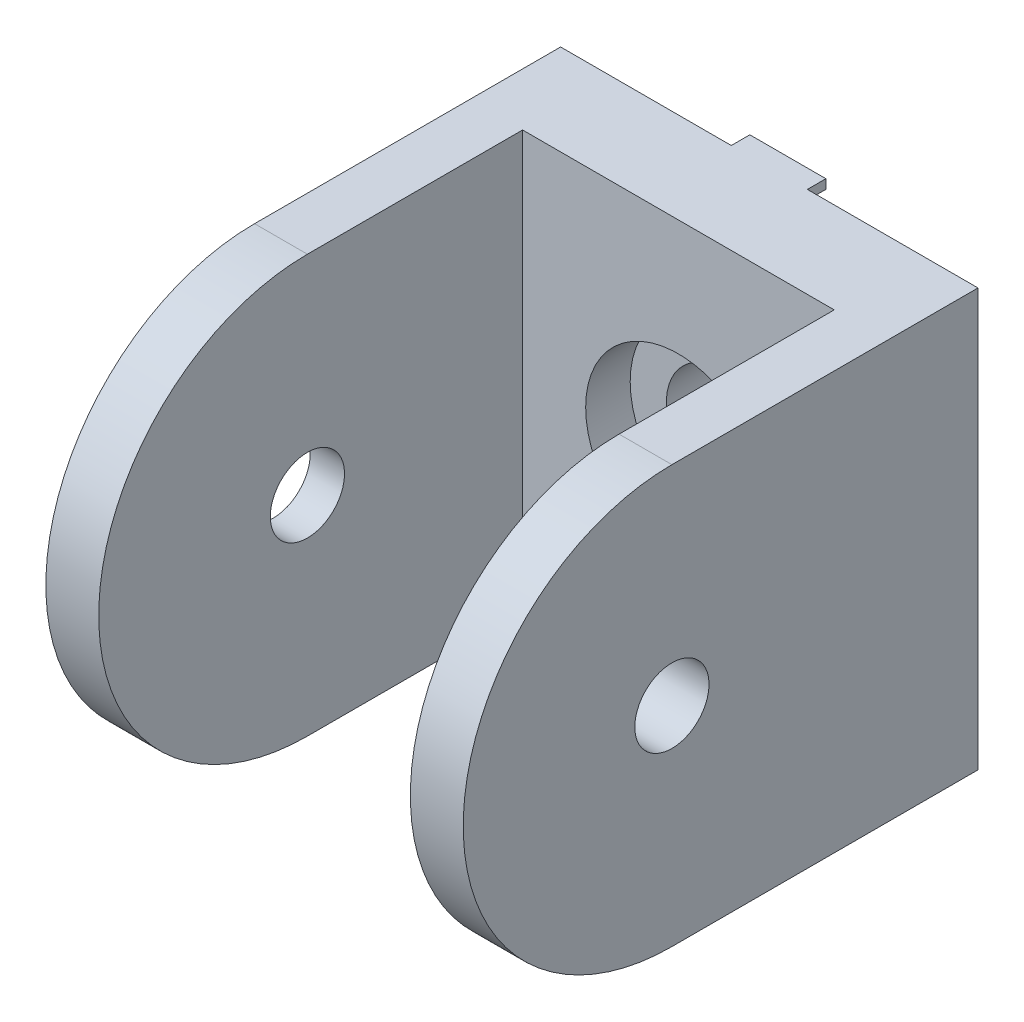
ISO-10303-21;
HEADER;
FILE_DESCRIPTION(('STEP AP214'),'2;1');
FILE_NAME('part.step','',(''),(''),'','','');
FILE_SCHEMA(('AUTOMOTIVE_DESIGN { 1 0 10303 214 1 1 1 1 }'));
ENDSEC;
DATA;
#1=APPLICATION_CONTEXT('core data for automotive mechanical design processes');
#2=APPLICATION_PROTOCOL_DEFINITION('international standard','automotive_design',2000,#1);
#3=PRODUCT_CONTEXT('',#1,'mechanical');
#4=PRODUCT('Part','Part','',(#3));
#5=PRODUCT_RELATED_PRODUCT_CATEGORY('part','',(#4));
#6=PRODUCT_DEFINITION_FORMATION('','',#4);
#7=PRODUCT_DEFINITION_CONTEXT('part definition',#1,'design');
#8=PRODUCT_DEFINITION('design','',#6,#7);
#9=PRODUCT_DEFINITION_SHAPE('','',#8);
#10=(LENGTH_UNIT() NAMED_UNIT(*) SI_UNIT(.MILLI.,.METRE.));
#11=(NAMED_UNIT(*) PLANE_ANGLE_UNIT() SI_UNIT($,.RADIAN.));
#12=(NAMED_UNIT(*) SI_UNIT($,.STERADIAN.) SOLID_ANGLE_UNIT());
#13=UNCERTAINTY_MEASURE_WITH_UNIT(LENGTH_MEASURE(1.E-05),#10,'distance_accuracy_value','');
#14=(GEOMETRIC_REPRESENTATION_CONTEXT(3) GLOBAL_UNCERTAINTY_ASSIGNED_CONTEXT((#13)) GLOBAL_UNIT_ASSIGNED_CONTEXT((#10,
#11,#12)) REPRESENTATION_CONTEXT('',''));
#15=CARTESIAN_POINT('',(0.,0.,0.));
#16=DIRECTION('',(0.,0.,1.));
#17=DIRECTION('',(1.,0.,0.));
#18=AXIS2_PLACEMENT_3D('',#15,#16,#17);
#19=CARTESIAN_POINT('',(0.,0.,0.));
#20=DIRECTION('',(0.,0.,1.));
#21=DIRECTION('',(1.,0.,0.));
#22=AXIS2_PLACEMENT_3D('',#19,#20,#21);
#23=CYLINDRICAL_SURFACE('',#22,6.1);
#24=CARTESIAN_POINT('',(0.,0.,0.));
#25=DIRECTION('',(0.,0.,1.));
#26=DIRECTION('',(1.,0.,0.));
#27=AXIS2_PLACEMENT_3D('',#24,#25,#26);
#28=CIRCLE('',#27,6.1);
#29=CARTESIAN_POINT('',(6.1,0.,0.));
#30=VERTEX_POINT('',#29);
#31=EDGE_CURVE('E279',#30,#30,#28,.T.);
#32=ORIENTED_EDGE('',*,*,#31,.F.);
#33=EDGE_LOOP('',(#32));
#34=FACE_BOUND('',#33,.T.);
#35=CARTESIAN_POINT('',(0.,0.,5.));
#36=DIRECTION('',(0.,0.,1.));
#37=DIRECTION('',(1.,0.,0.));
#38=AXIS2_PLACEMENT_3D('',#35,#36,#37);
#39=CIRCLE('',#38,6.1);
#40=CARTESIAN_POINT('',(6.1,0.,5.));
#41=VERTEX_POINT('',#40);
#42=EDGE_CURVE('E37',#41,#41,#39,.F.);
#43=ORIENTED_EDGE('',*,*,#42,.F.);
#44=EDGE_LOOP('',(#43));
#45=FACE_BOUND('',#44,.T.);
#46=ADVANCED_FACE('F33',(#34,#45),#23,.F.);
#47=CARTESIAN_POINT('',(22.5,22.5,0.));
#48=DIRECTION('',(0.,0.,-1.));
#49=DIRECTION('',(-1.,0.,0.));
#50=AXIS2_PLACEMENT_3D('',#47,#48,#49);
#51=PLANE('',#50);
#52=ORIENTED_EDGE('',*,*,#31,.T.);
#53=EDGE_LOOP('',(#52));
#54=FACE_BOUND('',#53,.T.);
#55=DIRECTION('',(1.,0.,0.));
#56=VECTOR('',#55,1.);
#57=CARTESIAN_POINT('',(4.09999999999999,-21.5,0.));
#58=LINE('',#57,#56);
#59=CARTESIAN_POINT('',(-4.09999999999999,-21.5,0.));
#60=VERTEX_POINT('',#59);
#61=CARTESIAN_POINT('',(4.1,-21.5,0.));
#62=VERTEX_POINT('',#61);
#63=EDGE_CURVE('E339',#60,#62,#58,.T.);
#64=ORIENTED_EDGE('',*,*,#63,.F.);
#65=DIRECTION('',(0.,1.,0.));
#66=VECTOR('',#65,1.);
#67=CARTESIAN_POINT('',(-4.09999999999999,-22.5,0.));
#68=LINE('',#67,#66);
#69=CARTESIAN_POINT('',(-4.09999999999999,-22.5,0.));
#70=VERTEX_POINT('',#69);
#71=EDGE_CURVE('E337',#70,#60,#68,.T.);
#72=ORIENTED_EDGE('',*,*,#71,.F.);
#73=DIRECTION('',(1.,0.,0.));
#74=VECTOR('',#73,1.);
#75=CARTESIAN_POINT('',(-22.5,-22.5,0.));
#76=LINE('',#75,#74);
#77=CARTESIAN_POINT('',(-22.5,-22.5,0.));
#78=VERTEX_POINT('',#77);
#79=EDGE_CURVE('E172',#78,#70,#76,.T.);
#80=ORIENTED_EDGE('',*,*,#79,.F.);
#81=DIRECTION('',(0.,-1.,0.));
#82=VECTOR('',#81,1.);
#83=CARTESIAN_POINT('',(-22.5,-22.5,0.));
#84=LINE('',#83,#82);
#85=CARTESIAN_POINT('',(-22.5,22.5,0.));
#86=VERTEX_POINT('',#85);
#87=EDGE_CURVE('E227',#86,#78,#84,.T.);
#88=ORIENTED_EDGE('',*,*,#87,.F.);
#89=DIRECTION('',(-1.,0.,0.));
#90=VECTOR('',#89,1.);
#91=CARTESIAN_POINT('',(-22.5,22.5,0.));
#92=LINE('',#91,#90);
#93=CARTESIAN_POINT('',(-4.10000000000001,22.5,0.));
#94=VERTEX_POINT('',#93);
#95=EDGE_CURVE('E217',#94,#86,#92,.T.);
#96=ORIENTED_EDGE('',*,*,#95,.F.);
#97=DIRECTION('',(0.,1.,0.));
#98=VECTOR('',#97,1.);
#99=CARTESIAN_POINT('',(-4.1,22.5,0.));
#100=LINE('',#99,#98);
#101=CARTESIAN_POINT('',(-4.1,21.5,0.));
#102=VERTEX_POINT('',#101);
#103=EDGE_CURVE('E184',#102,#94,#100,.T.);
#104=ORIENTED_EDGE('',*,*,#103,.F.);
#105=DIRECTION('',(-1.,0.,0.));
#106=VECTOR('',#105,1.);
#107=CARTESIAN_POINT('',(4.1,21.5,0.));
#108=LINE('',#107,#106);
#109=CARTESIAN_POINT('',(4.1,21.5,0.));
#110=VERTEX_POINT('',#109);
#111=EDGE_CURVE('E58',#110,#102,#108,.T.);
#112=ORIENTED_EDGE('',*,*,#111,.F.);
#113=DIRECTION('',(0.,-1.,0.));
#114=VECTOR('',#113,1.);
#115=CARTESIAN_POINT('',(4.1,22.5,0.));
#116=LINE('',#115,#114);
#117=CARTESIAN_POINT('',(4.09999999999999,22.5,0.));
#118=VERTEX_POINT('',#117);
#119=EDGE_CURVE('E173',#118,#110,#116,.T.);
#120=ORIENTED_EDGE('',*,*,#119,.F.);
#121=CARTESIAN_POINT('',(22.5,22.5,0.));
#122=VERTEX_POINT('',#121);
#123=EDGE_CURVE('E220',#122,#118,#92,.T.);
#124=ORIENTED_EDGE('',*,*,#123,.F.);
#125=DIRECTION('',(0.,1.,0.));
#126=VECTOR('',#125,1.);
#127=CARTESIAN_POINT('',(22.5,-22.5,0.));
#128=LINE('',#127,#126);
#129=CARTESIAN_POINT('',(22.5,-22.5,0.));
#130=VERTEX_POINT('',#129);
#131=EDGE_CURVE('E221',#130,#122,#128,.T.);
#132=ORIENTED_EDGE('',*,*,#131,.F.);
#133=CARTESIAN_POINT('',(4.09999999999999,-22.5,0.));
#134=VERTEX_POINT('',#133);
#135=EDGE_CURVE('E231',#134,#130,#76,.T.);
#136=ORIENTED_EDGE('',*,*,#135,.F.);
#137=DIRECTION('',(0.,-1.,0.));
#138=VECTOR('',#137,1.);
#139=CARTESIAN_POINT('',(4.09999999999999,-22.5,0.));
#140=LINE('',#139,#138);
#141=EDGE_CURVE('E166',#62,#134,#140,.T.);
#142=ORIENTED_EDGE('',*,*,#141,.F.);
#143=EDGE_LOOP('',(#64,#72,#80,#88,#96,#104,#112,#120,#124,#132,#136,#142));
#144=FACE_BOUND('',#143,.T.);
#145=ADVANCED_FACE('F336',(#54,#144),#51,.T.);
#146=CARTESIAN_POINT('',(22.5,0.,33.));
#147=DIRECTION('',(-1.,0.,0.));
#148=DIRECTION('',(0.,0.,1.));
#149=AXIS2_PLACEMENT_3D('',#146,#147,#148);
#150=CYLINDRICAL_SURFACE('',#149,4.00000000000001);
#151=CARTESIAN_POINT('',(-16.8,0.,33.));
#152=DIRECTION('',(-1.,0.,0.));
#153=DIRECTION('',(0.,0.,1.));
#154=AXIS2_PLACEMENT_3D('',#151,#152,#153);
#155=CIRCLE('',#154,4.00000000000001);
#156=CARTESIAN_POINT('',(-16.8,0.,37.));
#157=VERTEX_POINT('',#156);
#158=EDGE_CURVE('E264',#157,#157,#155,.T.);
#159=CARTESIAN_POINT('',(-20.5,0.,33.));
#160=DIRECTION('',(-1.,0.,0.));
#161=DIRECTION('',(0.,0.,1.));
#162=AXIS2_PLACEMENT_3D('',#159,#160,#161);
#163=CIRCLE('',#162,4.00000000000001);
#164=CARTESIAN_POINT('',(-20.5,0.,37.));
#165=VERTEX_POINT('',#164);
#166=EDGE_CURVE('E266',#165,#165,#163,.F.);
#167=CARTESIAN_POINT('',(-16.8,0.,37.));
#168=CARTESIAN_POINT('',(-16.8385416666667,0.,37.));
#169=CARTESIAN_POINT('',(-16.8770833333333,0.,37.));
#170=CARTESIAN_POINT('',(-16.9541666666667,0.,37.));
#171=CARTESIAN_POINT('',(-16.9927083333333,0.,37.));
#172=CARTESIAN_POINT('',(-17.0697916666667,0.,37.));
#173=CARTESIAN_POINT('',(-17.1083333333333,0.,37.));
#174=CARTESIAN_POINT('',(-17.1854166666667,0.,37.));
#175=CARTESIAN_POINT('',(-17.2239583333333,0.,37.));
#176=CARTESIAN_POINT('',(-17.3010416666667,0.,37.));
#177=CARTESIAN_POINT('',(-17.3395833333333,0.,37.));
#178=CARTESIAN_POINT('',(-17.4166666666667,0.,37.));
#179=CARTESIAN_POINT('',(-17.4552083333333,0.,37.));
#180=CARTESIAN_POINT('',(-17.5322916666667,0.,37.));
#181=CARTESIAN_POINT('',(-17.5708333333333,0.,37.));
#182=CARTESIAN_POINT('',(-17.6479166666667,0.,37.));
#183=CARTESIAN_POINT('',(-17.6864583333333,0.,37.));
#184=CARTESIAN_POINT('',(-17.7635416666667,0.,37.));
#185=CARTESIAN_POINT('',(-17.8020833333333,0.,37.));
#186=CARTESIAN_POINT('',(-17.8791666666667,0.,37.));
#187=CARTESIAN_POINT('',(-17.9177083333333,0.,37.));
#188=CARTESIAN_POINT('',(-17.9947916666667,0.,37.));
#189=CARTESIAN_POINT('',(-18.0333333333333,0.,37.));
#190=CARTESIAN_POINT('',(-18.1104166666667,0.,37.));
#191=CARTESIAN_POINT('',(-18.1489583333333,0.,37.));
#192=CARTESIAN_POINT('',(-18.2260416666667,0.,37.));
#193=CARTESIAN_POINT('',(-18.2645833333333,0.,37.));
#194=CARTESIAN_POINT('',(-18.3416666666667,0.,37.));
#195=CARTESIAN_POINT('',(-18.3802083333333,0.,37.));
#196=CARTESIAN_POINT('',(-18.4572916666667,0.,37.));
#197=CARTESIAN_POINT('',(-18.4958333333333,0.,37.));
#198=CARTESIAN_POINT('',(-18.5729166666667,0.,37.));
#199=CARTESIAN_POINT('',(-18.6114583333333,0.,37.));
#200=CARTESIAN_POINT('',(-18.6885416666667,0.,37.));
#201=CARTESIAN_POINT('',(-18.7270833333333,0.,37.));
#202=CARTESIAN_POINT('',(-18.8041666666667,0.,37.));
#203=CARTESIAN_POINT('',(-18.8427083333333,0.,37.));
#204=CARTESIAN_POINT('',(-18.9197916666667,0.,37.));
#205=CARTESIAN_POINT('',(-18.9583333333333,0.,37.));
#206=CARTESIAN_POINT('',(-19.0354166666667,0.,37.));
#207=CARTESIAN_POINT('',(-19.0739583333333,0.,37.));
#208=CARTESIAN_POINT('',(-19.1510416666667,0.,37.));
#209=CARTESIAN_POINT('',(-19.1895833333333,0.,37.));
#210=CARTESIAN_POINT('',(-19.2666666666667,0.,37.));
#211=CARTESIAN_POINT('',(-19.3052083333333,0.,37.));
#212=CARTESIAN_POINT('',(-19.3822916666667,0.,37.));
#213=CARTESIAN_POINT('',(-19.4208333333333,0.,37.));
#214=CARTESIAN_POINT('',(-19.4979166666667,0.,37.));
#215=CARTESIAN_POINT('',(-19.5364583333333,0.,37.));
#216=CARTESIAN_POINT('',(-19.6135416666667,0.,37.));
#217=CARTESIAN_POINT('',(-19.6520833333333,0.,37.));
#218=CARTESIAN_POINT('',(-19.7291666666667,0.,37.));
#219=CARTESIAN_POINT('',(-19.7677083333333,0.,37.));
#220=CARTESIAN_POINT('',(-19.8447916666667,0.,37.));
#221=CARTESIAN_POINT('',(-19.8833333333333,0.,37.));
#222=CARTESIAN_POINT('',(-19.9604166666667,0.,37.));
#223=CARTESIAN_POINT('',(-19.9989583333333,0.,37.));
#224=CARTESIAN_POINT('',(-20.0760416666667,0.,37.));
#225=CARTESIAN_POINT('',(-20.1145833333333,0.,37.));
#226=CARTESIAN_POINT('',(-20.1916666666667,0.,37.));
#227=CARTESIAN_POINT('',(-20.2302083333333,0.,37.));
#228=CARTESIAN_POINT('',(-20.3072916666667,0.,37.));
#229=CARTESIAN_POINT('',(-20.3458333333333,0.,37.));
#230=CARTESIAN_POINT('',(-20.4229166666667,0.,37.));
#231=CARTESIAN_POINT('',(-20.4614583333333,0.,37.));
#232=CARTESIAN_POINT('',(-20.5,0.,37.));
#233=B_SPLINE_CURVE_WITH_KNOTS('',3,(#167,#168,#169,#170,#171,#172,#173,#174,#175,#176,#177,
#178,#179,#180,#181,#182,#183,#184,#185,#186,#187,#188,#189,#190,#191,#192,#193,#194,#195,#196,
#197,#198,#199,#200,#201,#202,#203,#204,#205,#206,#207,#208,#209,#210,#211,#212,#213,#214,#215,
#216,#217,#218,#219,#220,#221,#222,#223,#224,#225,#226,#227,#228,#229,#230,#231,#232),
.UNSPECIFIED.,.F.,.F.,(4,2,2,2,2,2,2,2,2,2,2,2,2,2,2,2,2,2,2,2,2,2,2,2,2,2,2,2,2,2,2,2,4),(0.,
0.115625000000001,0.231250000000002,0.346875000000003,0.462500000000005,0.578124999999999,
0.69375,0.809375000000001,0.925000000000002,1.040625,1.15625,1.27187500000001,1.3875,1.503125,
1.61875,1.734375,1.85,1.96562500000001,2.08125000000001,2.19687500000001,2.31250000000001,
2.428125,2.54375,2.65937500000001,2.77500000000001,2.89062500000001,3.00625000000001,
3.12187500000001,3.2375,3.35312500000001,3.46875000000001,3.58437500000001,3.70000000000001),.UNSPECIFIED.);
#234=EDGE_CURVE('BSEAM373',#157,#165,#233,.T.);
#235=ORIENTED_EDGE('',*,*,#158,.F.);
#236=ORIENTED_EDGE('',*,*,#166,.F.);
#237=ORIENTED_EDGE('',*,*,#234,.T.);
#238=ORIENTED_EDGE('',*,*,#234,.F.);
#239=EDGE_LOOP('',(#235,#237,#236,#238));
#240=FACE_BOUND('',#239,.T.);
#241=ADVANCED_FACE('F373',(#240),#150,.F.);
#242=CARTESIAN_POINT('',(-22.5,22.5,9.8));
#243=DIRECTION('',(0.,-1.,0.));
#244=DIRECTION('',(0.,0.,-1.));
#245=AXIS2_PLACEMENT_3D('',#242,#243,#244);
#246=PLANE('',#245);
#247=DIRECTION('',(1.,0.,0.));
#248=VECTOR('',#247,1.);
#249=CARTESIAN_POINT('',(-177.176096742071,22.5,33.));
#250=LINE('',#249,#248);
#251=CARTESIAN_POINT('',(16.8,22.5,33.));
#252=VERTEX_POINT('',#251);
#253=CARTESIAN_POINT('',(22.5,22.5,33.));
#254=VERTEX_POINT('',#253);
#255=EDGE_CURVE('E286',#252,#254,#250,.T.);
#256=ORIENTED_EDGE('',*,*,#255,.T.);
#257=DIRECTION('',(0.,0.,-1.));
#258=VECTOR('',#257,1.);
#259=CARTESIAN_POINT('',(22.5,22.5,9.8));
#260=LINE('',#259,#258);
#261=EDGE_CURVE('E11',#254,#122,#260,.T.);
#262=ORIENTED_EDGE('',*,*,#261,.T.);
#263=ORIENTED_EDGE('',*,*,#123,.T.);
#264=DIRECTION('',(0.,0.,1.));
#265=VECTOR('',#264,1.);
#266=CARTESIAN_POINT('',(4.1,22.5,-2.));
#267=LINE('',#266,#265);
#268=CARTESIAN_POINT('',(4.1,22.5,-2.));
#269=VERTEX_POINT('',#268);
#270=EDGE_CURVE('E190',#269,#118,#267,.T.);
#271=ORIENTED_EDGE('',*,*,#270,.F.);
#272=DIRECTION('',(1.,0.,0.));
#273=VECTOR('',#272,1.);
#274=CARTESIAN_POINT('',(4.1,22.5,-2.));
#275=LINE('',#274,#273);
#276=CARTESIAN_POINT('',(-4.1,22.5,-2.));
#277=VERTEX_POINT('',#276);
#278=EDGE_CURVE('E188',#277,#269,#275,.T.);
#279=ORIENTED_EDGE('',*,*,#278,.F.);
#280=DIRECTION('',(0.,0.,1.));
#281=VECTOR('',#280,1.);
#282=CARTESIAN_POINT('',(-4.1,22.5,-2.));
#283=LINE('',#282,#281);
#284=EDGE_CURVE('E202',#277,#94,#283,.T.);
#285=ORIENTED_EDGE('',*,*,#284,.T.);
#286=ORIENTED_EDGE('',*,*,#95,.T.);
#287=DIRECTION('',(0.,0.,-1.));
#288=VECTOR('',#287,1.);
#289=CARTESIAN_POINT('',(-22.5,22.5,9.8));
#290=LINE('',#289,#288);
#291=CARTESIAN_POINT('',(-22.5,22.5,33.));
#292=VERTEX_POINT('',#291);
#293=EDGE_CURVE('E42',#292,#86,#290,.T.);
#294=ORIENTED_EDGE('',*,*,#293,.F.);
#295=CARTESIAN_POINT('',(-16.8,22.5,33.));
#296=VERTEX_POINT('',#295);
#297=EDGE_CURVE('E289',#292,#296,#250,.T.);
#298=ORIENTED_EDGE('',*,*,#297,.T.);
#299=DIRECTION('',(0.,0.,-1.));
#300=VECTOR('',#299,1.);
#301=CARTESIAN_POINT('',(-16.8,22.5,55.5));
#302=LINE('',#301,#300);
#303=CARTESIAN_POINT('',(-16.8,22.5,9.8));
#304=VERTEX_POINT('',#303);
#305=EDGE_CURVE('E257',#296,#304,#302,.T.);
#306=ORIENTED_EDGE('',*,*,#305,.T.);
#307=DIRECTION('',(-1.,0.,0.));
#308=VECTOR('',#307,1.);
#309=CARTESIAN_POINT('',(-22.5,22.5,9.8));
#310=LINE('',#309,#308);
#311=CARTESIAN_POINT('',(16.8,22.5,9.8));
#312=VERTEX_POINT('',#311);
#313=EDGE_CURVE('E233',#312,#304,#310,.T.);
#314=ORIENTED_EDGE('',*,*,#313,.F.);
#315=DIRECTION('',(0.,0.,-1.));
#316=VECTOR('',#315,1.);
#317=CARTESIAN_POINT('',(16.8,22.5,55.5));
#318=LINE('',#317,#316);
#319=EDGE_CURVE('E305',#252,#312,#318,.T.);
#320=ORIENTED_EDGE('',*,*,#319,.F.);
#321=EDGE_LOOP('',(#256,#262,#263,#271,#279,#285,#286,#294,#298,#306,#314,#320));
#322=FACE_BOUND('',#321,.T.);
#323=ADVANCED_FACE('F324',(#322),#246,.F.);
#324=CARTESIAN_POINT('',(22.5,22.5,9.8));
#325=DIRECTION('',(0.,0.,-1.));
#326=DIRECTION('',(-1.,0.,0.));
#327=AXIS2_PLACEMENT_3D('',#324,#325,#326);
#328=PLANE('',#327);
#329=CARTESIAN_POINT('',(0.,0.,9.8));
#330=DIRECTION('',(0.,0.,1.));
#331=DIRECTION('',(1.,0.,0.));
#332=AXIS2_PLACEMENT_3D('',#329,#330,#331);
#333=CIRCLE('',#332,10.);
#334=CARTESIAN_POINT('',(10.,0.,9.8));
#335=VERTEX_POINT('',#334);
#336=EDGE_CURVE('E351',#335,#335,#333,.T.);
#337=ORIENTED_EDGE('',*,*,#336,.F.);
#338=EDGE_LOOP('',(#337));
#339=FACE_BOUND('',#338,.T.);
#340=DIRECTION('',(0.,-1.,0.));
#341=VECTOR('',#340,1.);
#342=CARTESIAN_POINT('',(16.8,-22.5,9.8));
#343=LINE('',#342,#341);
#344=CARTESIAN_POINT('',(16.8,-22.5,9.8));
#345=VERTEX_POINT('',#344);
#346=EDGE_CURVE('E301',#312,#345,#343,.T.);
#347=ORIENTED_EDGE('',*,*,#346,.F.);
#348=ORIENTED_EDGE('',*,*,#313,.T.);
#349=DIRECTION('',(0.,1.,0.));
#350=VECTOR('',#349,1.);
#351=CARTESIAN_POINT('',(-16.8,-22.5,9.8));
#352=LINE('',#351,#350);
#353=CARTESIAN_POINT('',(-16.8,-22.5,9.8));
#354=VERTEX_POINT('',#353);
#355=EDGE_CURVE('E244',#354,#304,#352,.T.);
#356=ORIENTED_EDGE('',*,*,#355,.F.);
#357=DIRECTION('',(1.,0.,0.));
#358=VECTOR('',#357,1.);
#359=CARTESIAN_POINT('',(-22.5,-22.5,9.8));
#360=LINE('',#359,#358);
#361=EDGE_CURVE('E238',#354,#345,#360,.T.);
#362=ORIENTED_EDGE('',*,*,#361,.T.);
#363=EDGE_LOOP('',(#347,#348,#356,#362));
#364=FACE_BOUND('',#363,.T.);
#365=ADVANCED_FACE('F317',(#339,#364),#328,.F.);
#366=CARTESIAN_POINT('',(22.5,-22.5,9.8));
#367=DIRECTION('',(-1.,0.,0.));
#368=DIRECTION('',(0.,0.,1.));
#369=AXIS2_PLACEMENT_3D('',#366,#367,#368);
#370=PLANE('',#369);
#371=CARTESIAN_POINT('',(22.5,0.,33.));
#372=DIRECTION('',(-1.,0.,0.));
#373=DIRECTION('',(0.,0.,1.));
#374=AXIS2_PLACEMENT_3D('',#371,#372,#373);
#375=CIRCLE('',#374,4.00000000000001);
#376=CARTESIAN_POINT('',(22.5,0.,37.));
#377=VERTEX_POINT('',#376);
#378=EDGE_CURVE('E265',#377,#377,#375,.T.);
#379=ORIENTED_EDGE('',*,*,#378,.T.);
#380=EDGE_LOOP('',(#379));
#381=FACE_BOUND('',#380,.T.);
#382=CARTESIAN_POINT('',(22.5,0.,33.));
#383=DIRECTION('',(-1.,0.,0.));
#384=DIRECTION('',(0.,0.,1.));
#385=AXIS2_PLACEMENT_3D('',#382,#383,#384);
#386=CIRCLE('',#385,22.5);
#387=CARTESIAN_POINT('',(22.5,-22.5,33.));
#388=VERTEX_POINT('',#387);
#389=EDGE_CURVE('E296',#254,#388,#386,.F.);
#390=ORIENTED_EDGE('',*,*,#389,.T.);
#391=DIRECTION('',(0.,0.,-1.));
#392=VECTOR('',#391,1.);
#393=CARTESIAN_POINT('',(22.5,-22.5,9.8));
#394=LINE('',#393,#392);
#395=EDGE_CURVE('E234',#388,#130,#394,.T.);
#396=ORIENTED_EDGE('',*,*,#395,.T.);
#397=ORIENTED_EDGE('',*,*,#131,.T.);
#398=ORIENTED_EDGE('',*,*,#261,.F.);
#399=EDGE_LOOP('',(#390,#396,#397,#398));
#400=FACE_BOUND('',#399,.T.);
#401=ADVANCED_FACE('F35',(#381,#400),#370,.F.);
#402=CARTESIAN_POINT('',(-22.5,-22.5,9.8));
#403=DIRECTION('',(1.,0.,0.));
#404=DIRECTION('',(0.,0.,-1.));
#405=AXIS2_PLACEMENT_3D('',#402,#403,#404);
#406=PLANE('',#405);
#407=CARTESIAN_POINT('',(-22.5,0.,33.));
#408=DIRECTION('',(-1.,0.,0.));
#409=DIRECTION('',(0.,0.,1.));
#410=AXIS2_PLACEMENT_3D('',#407,#408,#409);
#411=CIRCLE('',#410,8.);
#412=CARTESIAN_POINT('',(-22.5,0.,41.));
#413=VERTEX_POINT('',#412);
#414=EDGE_CURVE('E274',#413,#413,#411,.T.);
#415=ORIENTED_EDGE('',*,*,#414,.F.);
#416=EDGE_LOOP('',(#415));
#417=FACE_BOUND('',#416,.T.);
#418=DIRECTION('',(0.,0.,-1.));
#419=VECTOR('',#418,1.);
#420=CARTESIAN_POINT('',(-22.5,-22.5,9.8));
#421=LINE('',#420,#419);
#422=CARTESIAN_POINT('',(-22.5,-22.5,33.));
#423=VERTEX_POINT('',#422);
#424=EDGE_CURVE('E237',#423,#78,#421,.T.);
#425=ORIENTED_EDGE('',*,*,#424,.F.);
#426=CARTESIAN_POINT('',(-22.5,0.,33.));
#427=DIRECTION('',(1.,0.,0.));
#428=DIRECTION('',(0.,0.,-1.));
#429=AXIS2_PLACEMENT_3D('',#426,#427,#428);
#430=CIRCLE('',#429,22.5);
#431=EDGE_CURVE('E299',#423,#292,#430,.F.);
#432=ORIENTED_EDGE('',*,*,#431,.T.);
#433=ORIENTED_EDGE('',*,*,#293,.T.);
#434=ORIENTED_EDGE('',*,*,#87,.T.);
#435=EDGE_LOOP('',(#425,#432,#433,#434));
#436=FACE_BOUND('',#435,.T.);
#437=ADVANCED_FACE('F333',(#417,#436),#406,.F.);
#438=CARTESIAN_POINT('',(-22.5,-22.5,9.8));
#439=DIRECTION('',(0.,1.,0.));
#440=DIRECTION('',(0.,0.,1.));
#441=AXIS2_PLACEMENT_3D('',#438,#439,#440);
#442=PLANE('',#441);
#443=ORIENTED_EDGE('',*,*,#395,.F.);
#444=DIRECTION('',(1.,0.,0.));
#445=VECTOR('',#444,1.);
#446=CARTESIAN_POINT('',(-177.176096742071,-22.5,33.));
#447=LINE('',#446,#445);
#448=CARTESIAN_POINT('',(16.8,-22.5,33.));
#449=VERTEX_POINT('',#448);
#450=EDGE_CURVE('E285',#449,#388,#447,.T.);
#451=ORIENTED_EDGE('',*,*,#450,.F.);
#452=DIRECTION('',(0.,0.,-1.));
#453=VECTOR('',#452,1.);
#454=CARTESIAN_POINT('',(16.8,-22.5,55.5));
#455=LINE('',#454,#453);
#456=EDGE_CURVE('E304',#449,#345,#455,.T.);
#457=ORIENTED_EDGE('',*,*,#456,.T.);
#458=ORIENTED_EDGE('',*,*,#361,.F.);
#459=DIRECTION('',(0.,0.,-1.));
#460=VECTOR('',#459,1.);
#461=CARTESIAN_POINT('',(-16.8,-22.5,55.5));
#462=LINE('',#461,#460);
#463=CARTESIAN_POINT('',(-16.8,-22.5,33.));
#464=VERTEX_POINT('',#463);
#465=EDGE_CURVE('E259',#464,#354,#462,.T.);
#466=ORIENTED_EDGE('',*,*,#465,.F.);
#467=EDGE_CURVE('E290',#423,#464,#447,.T.);
#468=ORIENTED_EDGE('',*,*,#467,.F.);
#469=ORIENTED_EDGE('',*,*,#424,.T.);
#470=ORIENTED_EDGE('',*,*,#79,.T.);
#471=DIRECTION('',(0.,0.,1.));
#472=VECTOR('',#471,1.);
#473=CARTESIAN_POINT('',(-4.09999999999999,-22.5,-2.));
#474=LINE('',#473,#472);
#475=CARTESIAN_POINT('',(-4.09999999999999,-22.5,-2.));
#476=VERTEX_POINT('',#475);
#477=EDGE_CURVE('E151',#476,#70,#474,.T.);
#478=ORIENTED_EDGE('',*,*,#477,.F.);
#479=DIRECTION('',(-1.,0.,0.));
#480=VECTOR('',#479,1.);
#481=CARTESIAN_POINT('',(4.09999999999999,-22.5,-2.));
#482=LINE('',#481,#480);
#483=CARTESIAN_POINT('',(4.09999999999999,-22.5,-2.));
#484=VERTEX_POINT('',#483);
#485=EDGE_CURVE('E158',#484,#476,#482,.T.);
#486=ORIENTED_EDGE('',*,*,#485,.F.);
#487=DIRECTION('',(0.,0.,1.));
#488=VECTOR('',#487,1.);
#489=CARTESIAN_POINT('',(4.09999999999999,-22.5,-2.));
#490=LINE('',#489,#488);
#491=EDGE_CURVE('E348',#484,#134,#490,.T.);
#492=ORIENTED_EDGE('',*,*,#491,.T.);
#493=ORIENTED_EDGE('',*,*,#135,.T.);
#494=EDGE_LOOP('',(#443,#451,#457,#458,#466,#468,#469,#470,#478,#486,#492,#493));
#495=FACE_BOUND('',#494,.T.);
#496=ADVANCED_FACE('F170',(#495),#442,.F.);
#497=CARTESIAN_POINT('',(-16.8,-22.5,55.5));
#498=DIRECTION('',(-1.,0.,0.));
#499=DIRECTION('',(0.,0.,1.));
#500=AXIS2_PLACEMENT_3D('',#497,#498,#499);
#501=PLANE('',#500);
#502=ORIENTED_EDGE('',*,*,#158,.T.);
#503=EDGE_LOOP('',(#502));
#504=FACE_BOUND('',#503,.T.);
#505=CARTESIAN_POINT('',(-16.8,0.,33.));
#506=DIRECTION('',(-1.,0.,0.));
#507=DIRECTION('',(0.,0.,1.));
#508=AXIS2_PLACEMENT_3D('',#505,#506,#507);
#509=CIRCLE('',#508,22.5);
#510=EDGE_CURVE('E295',#296,#464,#509,.F.);
#511=ORIENTED_EDGE('',*,*,#510,.T.);
#512=ORIENTED_EDGE('',*,*,#465,.T.);
#513=ORIENTED_EDGE('',*,*,#355,.T.);
#514=ORIENTED_EDGE('',*,*,#305,.F.);
#515=EDGE_LOOP('',(#511,#512,#513,#514));
#516=FACE_BOUND('',#515,.T.);
#517=ADVANCED_FACE('F313',(#504,#516),#501,.F.);
#518=CARTESIAN_POINT('',(16.8,-22.5,55.5));
#519=DIRECTION('',(1.,0.,0.));
#520=DIRECTION('',(0.,0.,-1.));
#521=AXIS2_PLACEMENT_3D('',#518,#519,#520);
#522=PLANE('',#521);
#523=CARTESIAN_POINT('',(16.8,0.,33.));
#524=DIRECTION('',(1.,0.,0.));
#525=DIRECTION('',(0.,0.,-1.));
#526=AXIS2_PLACEMENT_3D('',#523,#524,#525);
#527=CIRCLE('',#526,4.00000000000001);
#528=CARTESIAN_POINT('',(16.8,0.,37.));
#529=VERTEX_POINT('',#528);
#530=EDGE_CURVE('E262',#529,#529,#527,.T.);
#531=ORIENTED_EDGE('',*,*,#530,.T.);
#532=EDGE_LOOP('',(#531));
#533=FACE_BOUND('',#532,.T.);
#534=ORIENTED_EDGE('',*,*,#456,.F.);
#535=CARTESIAN_POINT('',(16.8,0.,33.));
#536=DIRECTION('',(1.,0.,0.));
#537=DIRECTION('',(0.,0.,-1.));
#538=AXIS2_PLACEMENT_3D('',#535,#536,#537);
#539=CIRCLE('',#538,22.5);
#540=EDGE_CURVE('E293',#449,#252,#539,.F.);
#541=ORIENTED_EDGE('',*,*,#540,.T.);
#542=ORIENTED_EDGE('',*,*,#319,.T.);
#543=ORIENTED_EDGE('',*,*,#346,.T.);
#544=EDGE_LOOP('',(#534,#541,#542,#543));
#545=FACE_BOUND('',#544,.T.);
#546=ADVANCED_FACE('F322',(#533,#545),#522,.F.);
#547=CARTESIAN_POINT('',(-177.176096742071,0.,33.));
#548=DIRECTION('',(1.,0.,0.));
#549=DIRECTION('',(0.,0.,-1.));
#550=AXIS2_PLACEMENT_3D('',#547,#548,#549);
#551=CYLINDRICAL_SURFACE('',#550,22.5);
#552=ORIENTED_EDGE('',*,*,#450,.T.);
#553=ORIENTED_EDGE('',*,*,#389,.F.);
#554=ORIENTED_EDGE('',*,*,#255,.F.);
#555=ORIENTED_EDGE('',*,*,#540,.F.);
#556=EDGE_LOOP('',(#552,#553,#554,#555));
#557=FACE_BOUND('',#556,.T.);
#558=ADVANCED_FACE('F400',(#557),#551,.T.);
#559=ORIENTED_EDGE('',*,*,#431,.F.);
#560=ORIENTED_EDGE('',*,*,#467,.T.);
#561=ORIENTED_EDGE('',*,*,#510,.F.);
#562=ORIENTED_EDGE('',*,*,#297,.F.);
#563=EDGE_LOOP('',(#559,#560,#561,#562));
#564=FACE_BOUND('',#563,.T.);
#565=ADVANCED_FACE('F329',(#564),#551,.T.);
#566=CARTESIAN_POINT('',(22.5,0.,37.));
#567=CARTESIAN_POINT('',(22.440625,0.,37.));
#568=CARTESIAN_POINT('',(22.38125,0.,37.));
#569=CARTESIAN_POINT('',(22.2625,0.,37.));
#570=CARTESIAN_POINT('',(22.203125,0.,37.));
#571=CARTESIAN_POINT('',(22.084375,0.,37.));
#572=CARTESIAN_POINT('',(22.025,0.,37.));
#573=CARTESIAN_POINT('',(21.90625,0.,37.));
#574=CARTESIAN_POINT('',(21.846875,0.,37.));
#575=CARTESIAN_POINT('',(21.728125,0.,37.));
#576=CARTESIAN_POINT('',(21.66875,0.,37.));
#577=CARTESIAN_POINT('',(21.55,0.,37.));
#578=CARTESIAN_POINT('',(21.490625,0.,37.));
#579=CARTESIAN_POINT('',(21.371875,0.,37.));
#580=CARTESIAN_POINT('',(21.3125,0.,37.));
#581=CARTESIAN_POINT('',(21.19375,0.,37.));
#582=CARTESIAN_POINT('',(21.134375,0.,37.));
#583=CARTESIAN_POINT('',(21.015625,0.,37.));
#584=CARTESIAN_POINT('',(20.95625,0.,37.));
#585=CARTESIAN_POINT('',(20.8375,0.,37.));
#586=CARTESIAN_POINT('',(20.778125,0.,37.));
#587=CARTESIAN_POINT('',(20.659375,0.,37.));
#588=CARTESIAN_POINT('',(20.6,0.,37.));
#589=CARTESIAN_POINT('',(20.48125,0.,37.));
#590=CARTESIAN_POINT('',(20.421875,0.,37.));
#591=CARTESIAN_POINT('',(20.303125,0.,37.));
#592=CARTESIAN_POINT('',(20.24375,0.,37.));
#593=CARTESIAN_POINT('',(20.125,0.,37.));
#594=CARTESIAN_POINT('',(20.065625,0.,37.));
#595=CARTESIAN_POINT('',(19.946875,0.,37.));
#596=CARTESIAN_POINT('',(19.8875,0.,37.));
#597=CARTESIAN_POINT('',(19.76875,0.,37.));
#598=CARTESIAN_POINT('',(19.709375,0.,37.));
#599=CARTESIAN_POINT('',(19.590625,0.,37.));
#600=CARTESIAN_POINT('',(19.53125,0.,37.));
#601=CARTESIAN_POINT('',(19.4125,0.,37.));
#602=CARTESIAN_POINT('',(19.353125,0.,37.));
#603=CARTESIAN_POINT('',(19.234375,0.,37.));
#604=CARTESIAN_POINT('',(19.175,0.,37.));
#605=CARTESIAN_POINT('',(19.05625,0.,37.));
#606=CARTESIAN_POINT('',(18.996875,0.,37.));
#607=CARTESIAN_POINT('',(18.878125,0.,37.));
#608=CARTESIAN_POINT('',(18.81875,0.,37.));
#609=CARTESIAN_POINT('',(18.7,0.,37.));
#610=CARTESIAN_POINT('',(18.640625,0.,37.));
#611=CARTESIAN_POINT('',(18.521875,0.,37.));
#612=CARTESIAN_POINT('',(18.4625,0.,37.));
#613=CARTESIAN_POINT('',(18.34375,0.,37.));
#614=CARTESIAN_POINT('',(18.284375,0.,37.));
#615=CARTESIAN_POINT('',(18.165625,0.,37.));
#616=CARTESIAN_POINT('',(18.10625,0.,37.));
#617=CARTESIAN_POINT('',(17.9875,0.,37.));
#618=CARTESIAN_POINT('',(17.928125,0.,37.));
#619=CARTESIAN_POINT('',(17.809375,0.,37.));
#620=CARTESIAN_POINT('',(17.75,0.,37.));
#621=CARTESIAN_POINT('',(17.63125,0.,37.));
#622=CARTESIAN_POINT('',(17.571875,0.,37.));
#623=CARTESIAN_POINT('',(17.453125,0.,37.));
#624=CARTESIAN_POINT('',(17.39375,0.,37.));
#625=CARTESIAN_POINT('',(17.275,0.,37.));
#626=CARTESIAN_POINT('',(17.215625,0.,37.));
#627=CARTESIAN_POINT('',(17.096875,0.,37.));
#628=CARTESIAN_POINT('',(17.0375,0.,37.));
#629=CARTESIAN_POINT('',(16.91875,0.,37.));
#630=CARTESIAN_POINT('',(16.859375,0.,37.));
#631=CARTESIAN_POINT('',(16.8,0.,37.));
#632=B_SPLINE_CURVE_WITH_KNOTS('',3,(#566,#567,#568,#569,#570,#571,#572,#573,#574,#575,#576,
#577,#578,#579,#580,#581,#582,#583,#584,#585,#586,#587,#588,#589,#590,#591,#592,#593,#594,#595,
#596,#597,#598,#599,#600,#601,#602,#603,#604,#605,#606,#607,#608,#609,#610,#611,#612,#613,#614,
#615,#616,#617,#618,#619,#620,#621,#622,#623,#624,#625,#626,#627,#628,#629,#630,#631),
.UNSPECIFIED.,.F.,.F.,(4,2,2,2,2,2,2,2,2,2,2,2,2,2,2,2,2,2,2,2,2,2,2,2,2,2,2,2,2,2,2,2,4),(0.,
0.178125000000001,0.356250000000002,0.534375000000004,0.712500000000001,0.890625000000003,
1.06875,1.246875,1.425,1.603125,1.78125000000001,1.959375,2.1375,2.31562500000001,2.49375,
2.671875,2.85000000000001,3.02812500000001,3.20625,3.38437500000001,3.56250000000001,3.740625,
3.91875000000001,4.09687500000001,4.27500000000001,4.45312500000001,4.63125000000001,
4.80937500000001,4.98750000000001,5.16562500000001,5.34375000000001,5.52187500000001,
5.70000000000001),.UNSPECIFIED.);
#633=EDGE_CURVE('BSEAM393',#377,#529,#632,.T.);
#634=ORIENTED_EDGE('',*,*,#378,.F.);
#635=ORIENTED_EDGE('',*,*,#530,.F.);
#636=ORIENTED_EDGE('',*,*,#633,.T.);
#637=ORIENTED_EDGE('',*,*,#633,.F.);
#638=EDGE_LOOP('',(#634,#636,#635,#637));
#639=FACE_BOUND('',#638,.T.);
#640=ADVANCED_FACE('F393',(#639),#150,.F.);
#641=CARTESIAN_POINT('',(-20.5,0.,33.));
#642=DIRECTION('',(-1.,0.,0.));
#643=DIRECTION('',(0.,0.,1.));
#644=AXIS2_PLACEMENT_3D('',#641,#642,#643);
#645=PLANE('',#644);
#646=CARTESIAN_POINT('',(-20.5,0.,33.));
#647=DIRECTION('',(-1.,0.,0.));
#648=DIRECTION('',(0.,0.,1.));
#649=AXIS2_PLACEMENT_3D('',#646,#647,#648);
#650=CIRCLE('',#649,8.);
#651=CARTESIAN_POINT('',(-20.5,0.,41.));
#652=VERTEX_POINT('',#651);
#653=EDGE_CURVE('E268',#652,#652,#650,.T.);
#654=ORIENTED_EDGE('',*,*,#653,.T.);
#655=EDGE_LOOP('',(#654));
#656=FACE_BOUND('',#655,.T.);
#657=ORIENTED_EDGE('',*,*,#166,.T.);
#658=EDGE_LOOP('',(#657));
#659=FACE_BOUND('',#658,.T.);
#660=ADVANCED_FACE('F389',(#656,#659),#645,.T.);
#661=CARTESIAN_POINT('',(-20.5,0.,33.));
#662=DIRECTION('',(-1.,0.,0.));
#663=DIRECTION('',(0.,0.,1.));
#664=AXIS2_PLACEMENT_3D('',#661,#662,#663);
#665=CYLINDRICAL_SURFACE('',#664,8.);
#666=ORIENTED_EDGE('',*,*,#653,.F.);
#667=EDGE_LOOP('',(#666));
#668=FACE_BOUND('',#667,.T.);
#669=ORIENTED_EDGE('',*,*,#414,.T.);
#670=EDGE_LOOP('',(#669));
#671=FACE_BOUND('',#670,.T.);
#672=ADVANCED_FACE('F392',(#668,#671),#665,.F.);
#673=CARTESIAN_POINT('',(4.1,22.5,-2.));
#674=DIRECTION('',(-1.,0.,0.));
#675=DIRECTION('',(0.,0.,1.));
#676=AXIS2_PLACEMENT_3D('',#673,#674,#675);
#677=PLANE('',#676);
#678=ORIENTED_EDGE('',*,*,#119,.T.);
#679=DIRECTION('',(0.,0.,1.));
#680=VECTOR('',#679,1.);
#681=CARTESIAN_POINT('',(4.1,21.5,-2.));
#682=LINE('',#681,#680);
#683=CARTESIAN_POINT('',(4.1,21.5,-2.));
#684=VERTEX_POINT('',#683);
#685=EDGE_CURVE('E209',#684,#110,#682,.T.);
#686=ORIENTED_EDGE('',*,*,#685,.F.);
#687=DIRECTION('',(0.,-1.,0.));
#688=VECTOR('',#687,1.);
#689=CARTESIAN_POINT('',(4.1,22.5,-2.));
#690=LINE('',#689,#688);
#691=EDGE_CURVE('E180',#269,#684,#690,.T.);
#692=ORIENTED_EDGE('',*,*,#691,.F.);
#693=ORIENTED_EDGE('',*,*,#270,.T.);
#694=EDGE_LOOP('',(#678,#686,#692,#693));
#695=FACE_BOUND('',#694,.T.);
#696=ADVANCED_FACE('F387',(#695),#677,.F.);
#697=CARTESIAN_POINT('',(4.1,21.5,-2.));
#698=DIRECTION('',(0.,1.,0.));
#699=DIRECTION('',(0.,0.,1.));
#700=AXIS2_PLACEMENT_3D('',#697,#698,#699);
#701=PLANE('',#700);
#702=ORIENTED_EDGE('',*,*,#111,.T.);
#703=DIRECTION('',(0.,0.,1.));
#704=VECTOR('',#703,1.);
#705=CARTESIAN_POINT('',(-4.1,21.5,-2.));
#706=LINE('',#705,#704);
#707=CARTESIAN_POINT('',(-4.1,21.5,-2.));
#708=VERTEX_POINT('',#707);
#709=EDGE_CURVE('E194',#708,#102,#706,.T.);
#710=ORIENTED_EDGE('',*,*,#709,.F.);
#711=DIRECTION('',(-1.,0.,0.));
#712=VECTOR('',#711,1.);
#713=CARTESIAN_POINT('',(4.1,21.5,-2.));
#714=LINE('',#713,#712);
#715=EDGE_CURVE('E183',#684,#708,#714,.T.);
#716=ORIENTED_EDGE('',*,*,#715,.F.);
#717=ORIENTED_EDGE('',*,*,#685,.T.);
#718=EDGE_LOOP('',(#702,#710,#716,#717));
#719=FACE_BOUND('',#718,.T.);
#720=ADVANCED_FACE('F487',(#719),#701,.F.);
#721=CARTESIAN_POINT('',(-4.1,22.5,-2.));
#722=DIRECTION('',(1.,0.,0.));
#723=DIRECTION('',(0.,0.,-1.));
#724=AXIS2_PLACEMENT_3D('',#721,#722,#723);
#725=PLANE('',#724);
#726=ORIENTED_EDGE('',*,*,#103,.T.);
#727=ORIENTED_EDGE('',*,*,#284,.F.);
#728=DIRECTION('',(0.,1.,0.));
#729=VECTOR('',#728,1.);
#730=CARTESIAN_POINT('',(-4.1,22.5,-2.));
#731=LINE('',#730,#729);
#732=EDGE_CURVE('E186',#708,#277,#731,.T.);
#733=ORIENTED_EDGE('',*,*,#732,.F.);
#734=ORIENTED_EDGE('',*,*,#709,.T.);
#735=EDGE_LOOP('',(#726,#727,#733,#734));
#736=FACE_BOUND('',#735,.T.);
#737=ADVANCED_FACE('F495',(#736),#725,.F.);
#738=CARTESIAN_POINT('',(4.1,21.5,-2.));
#739=DIRECTION('',(0.,0.,-1.));
#740=DIRECTION('',(-1.,0.,0.));
#741=AXIS2_PLACEMENT_3D('',#738,#739,#740);
#742=PLANE('',#741);
#743=ORIENTED_EDGE('',*,*,#691,.T.);
#744=ORIENTED_EDGE('',*,*,#715,.T.);
#745=ORIENTED_EDGE('',*,*,#732,.T.);
#746=ORIENTED_EDGE('',*,*,#278,.T.);
#747=EDGE_LOOP('',(#743,#744,#745,#746));
#748=FACE_BOUND('',#747,.T.);
#749=ADVANCED_FACE('F504',(#748),#742,.T.);
#750=CARTESIAN_POINT('',(-4.09999999999999,-22.5,-2.));
#751=DIRECTION('',(1.,0.,0.));
#752=DIRECTION('',(0.,0.,-1.));
#753=AXIS2_PLACEMENT_3D('',#750,#751,#752);
#754=PLANE('',#753);
#755=ORIENTED_EDGE('',*,*,#71,.T.);
#756=DIRECTION('',(0.,0.,1.));
#757=VECTOR('',#756,1.);
#758=CARTESIAN_POINT('',(-4.09999999999999,-21.5,-2.));
#759=LINE('',#758,#757);
#760=CARTESIAN_POINT('',(-4.09999999999999,-21.5,-2.));
#761=VERTEX_POINT('',#760);
#762=EDGE_CURVE('E154',#761,#60,#759,.T.);
#763=ORIENTED_EDGE('',*,*,#762,.F.);
#764=DIRECTION('',(0.,1.,0.));
#765=VECTOR('',#764,1.);
#766=CARTESIAN_POINT('',(-4.09999999999999,-22.5,-2.));
#767=LINE('',#766,#765);
#768=EDGE_CURVE('E147',#476,#761,#767,.T.);
#769=ORIENTED_EDGE('',*,*,#768,.F.);
#770=ORIENTED_EDGE('',*,*,#477,.T.);
#771=EDGE_LOOP('',(#755,#763,#769,#770));
#772=FACE_BOUND('',#771,.T.);
#773=ADVANCED_FACE('F149',(#772),#754,.F.);
#774=CARTESIAN_POINT('',(4.09999999999999,-21.5,-2.));
#775=DIRECTION('',(0.,-1.,0.));
#776=DIRECTION('',(0.,0.,-1.));
#777=AXIS2_PLACEMENT_3D('',#774,#775,#776);
#778=PLANE('',#777);
#779=ORIENTED_EDGE('',*,*,#63,.T.);
#780=DIRECTION('',(0.,0.,1.));
#781=VECTOR('',#780,1.);
#782=CARTESIAN_POINT('',(4.09999999999999,-21.5,-2.));
#783=LINE('',#782,#781);
#784=CARTESIAN_POINT('',(4.09999999999999,-21.5,-2.));
#785=VERTEX_POINT('',#784);
#786=EDGE_CURVE('E50',#785,#62,#783,.T.);
#787=ORIENTED_EDGE('',*,*,#786,.F.);
#788=DIRECTION('',(1.,0.,0.));
#789=VECTOR('',#788,1.);
#790=CARTESIAN_POINT('',(4.09999999999999,-21.5,-2.));
#791=LINE('',#790,#789);
#792=EDGE_CURVE('E157',#761,#785,#791,.T.);
#793=ORIENTED_EDGE('',*,*,#792,.F.);
#794=ORIENTED_EDGE('',*,*,#762,.T.);
#795=EDGE_LOOP('',(#779,#787,#793,#794));
#796=FACE_BOUND('',#795,.T.);
#797=ADVANCED_FACE('F523',(#796),#778,.F.);
#798=CARTESIAN_POINT('',(4.09999999999999,-22.5,-2.));
#799=DIRECTION('',(-1.,0.,0.));
#800=DIRECTION('',(0.,0.,1.));
#801=AXIS2_PLACEMENT_3D('',#798,#799,#800);
#802=PLANE('',#801);
#803=ORIENTED_EDGE('',*,*,#141,.T.);
#804=ORIENTED_EDGE('',*,*,#491,.F.);
#805=DIRECTION('',(0.,-1.,0.));
#806=VECTOR('',#805,1.);
#807=CARTESIAN_POINT('',(4.09999999999999,-22.5,-2.));
#808=LINE('',#807,#806);
#809=EDGE_CURVE('E162',#785,#484,#808,.T.);
#810=ORIENTED_EDGE('',*,*,#809,.F.);
#811=ORIENTED_EDGE('',*,*,#786,.T.);
#812=EDGE_LOOP('',(#803,#804,#810,#811));
#813=FACE_BOUND('',#812,.T.);
#814=ADVANCED_FACE('F532',(#813),#802,.F.);
#815=CARTESIAN_POINT('',(-4.09999999999999,-22.5,-2.));
#816=DIRECTION('',(0.,0.,-1.));
#817=DIRECTION('',(-1.,0.,0.));
#818=AXIS2_PLACEMENT_3D('',#815,#816,#817);
#819=PLANE('',#818);
#820=ORIENTED_EDGE('',*,*,#485,.T.);
#821=ORIENTED_EDGE('',*,*,#768,.T.);
#822=ORIENTED_EDGE('',*,*,#792,.T.);
#823=ORIENTED_EDGE('',*,*,#809,.T.);
#824=EDGE_LOOP('',(#820,#821,#822,#823));
#825=FACE_BOUND('',#824,.T.);
#826=ADVANCED_FACE('F161',(#825),#819,.T.);
#827=CARTESIAN_POINT('',(0.,0.,5.));
#828=DIRECTION('',(0.,0.,1.));
#829=DIRECTION('',(1.,0.,0.));
#830=AXIS2_PLACEMENT_3D('',#827,#828,#829);
#831=PLANE('',#830);
#832=CARTESIAN_POINT('',(0.,0.,5.));
#833=DIRECTION('',(0.,0.,1.));
#834=DIRECTION('',(1.,0.,0.));
#835=AXIS2_PLACEMENT_3D('',#832,#833,#834);
#836=CIRCLE('',#835,10.);
#837=CARTESIAN_POINT('',(10.,0.,5.));
#838=VERTEX_POINT('',#837);
#839=EDGE_CURVE('E343',#838,#838,#836,.T.);
#840=ORIENTED_EDGE('',*,*,#839,.T.);
#841=EDGE_LOOP('',(#840));
#842=FACE_BOUND('',#841,.T.);
#843=ORIENTED_EDGE('',*,*,#42,.T.);
#844=EDGE_LOOP('',(#843));
#845=FACE_BOUND('',#844,.T.);
#846=ADVANCED_FACE('F357',(#842,#845),#831,.T.);
#847=CARTESIAN_POINT('',(0.,0.,5.));
#848=DIRECTION('',(0.,0.,1.));
#849=DIRECTION('',(1.,0.,0.));
#850=AXIS2_PLACEMENT_3D('',#847,#848,#849);
#851=CYLINDRICAL_SURFACE('',#850,10.);
#852=ORIENTED_EDGE('',*,*,#839,.F.);
#853=EDGE_LOOP('',(#852));
#854=FACE_BOUND('',#853,.T.);
#855=ORIENTED_EDGE('',*,*,#336,.T.);
#856=EDGE_LOOP('',(#855));
#857=FACE_BOUND('',#856,.T.);
#858=ADVANCED_FACE('F360',(#854,#857),#851,.F.);
#859=CLOSED_SHELL('',(#46,#145,#241,#323,#365,#401,#437,#496,#517,#546,#558,#565,#640,#660,#672,
#696,#720,#737,#749,#773,#797,#814,#826,#846,#858));
#860=MANIFOLD_SOLID_BREP('B2',#859);
#861=ADVANCED_BREP_SHAPE_REPRESENTATION('',(#18,#860),#14);
#862=SHAPE_DEFINITION_REPRESENTATION(#9,#861);
ENDSEC;
END-ISO-10303-21;
